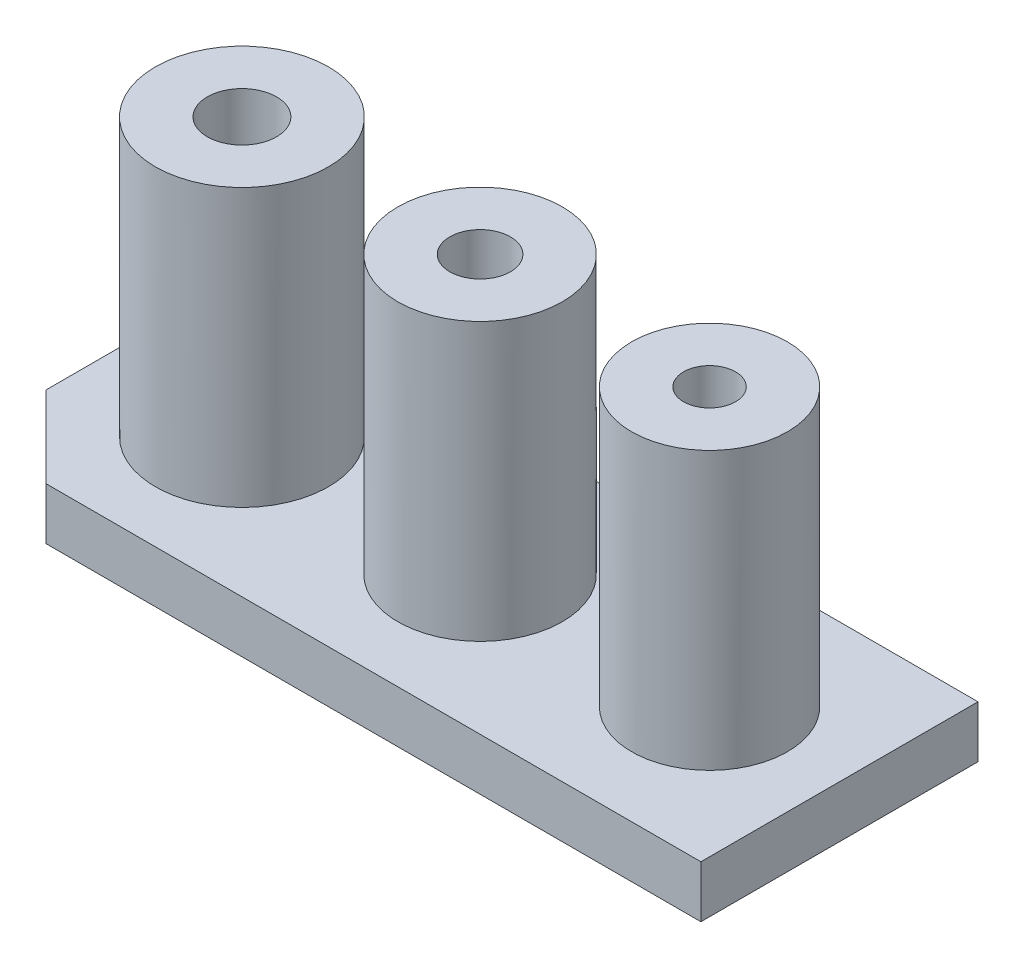
ISO-10303-21;
HEADER;
FILE_DESCRIPTION(('STEP AP214'),'2;1');
FILE_NAME('part.step','',(''),(''),'','','');
FILE_SCHEMA(('AUTOMOTIVE_DESIGN { 1 0 10303 214 1 1 1 1 }'));
ENDSEC;
DATA;
#1=APPLICATION_CONTEXT('core data for automotive mechanical design processes');
#2=APPLICATION_PROTOCOL_DEFINITION('international standard','automotive_design',2000,#1);
#3=PRODUCT_CONTEXT('',#1,'mechanical');
#4=PRODUCT('Part','Part','',(#3));
#5=PRODUCT_RELATED_PRODUCT_CATEGORY('part','',(#4));
#6=PRODUCT_DEFINITION_FORMATION('','',#4);
#7=PRODUCT_DEFINITION_CONTEXT('part definition',#1,'design');
#8=PRODUCT_DEFINITION('design','',#6,#7);
#9=PRODUCT_DEFINITION_SHAPE('','',#8);
#10=(LENGTH_UNIT() NAMED_UNIT(*) SI_UNIT(.MILLI.,.METRE.));
#11=(NAMED_UNIT(*) PLANE_ANGLE_UNIT() SI_UNIT($,.RADIAN.));
#12=(NAMED_UNIT(*) SI_UNIT($,.STERADIAN.) SOLID_ANGLE_UNIT());
#13=UNCERTAINTY_MEASURE_WITH_UNIT(LENGTH_MEASURE(1.E-05),#10,'distance_accuracy_value','');
#14=(GEOMETRIC_REPRESENTATION_CONTEXT(3) GLOBAL_UNCERTAINTY_ASSIGNED_CONTEXT((#13)) GLOBAL_UNIT_ASSIGNED_CONTEXT((#10,
#11,#12)) REPRESENTATION_CONTEXT('',''));
#15=CARTESIAN_POINT('',(0.,0.,0.));
#16=DIRECTION('',(0.,0.,1.));
#17=DIRECTION('',(1.,0.,0.));
#18=AXIS2_PLACEMENT_3D('',#15,#16,#17);
#19=CARTESIAN_POINT('',(0.,8.,0.));
#20=DIRECTION('',(0.,1.,0.));
#21=DIRECTION('',(0.,0.,1.));
#22=AXIS2_PLACEMENT_3D('',#19,#20,#21);
#23=PLANE('',#22);
#24=CARTESIAN_POINT('',(0.,8.,0.));
#25=DIRECTION('',(0.,1.,0.));
#26=DIRECTION('',(0.,0.,1.));
#27=AXIS2_PLACEMENT_3D('',#24,#25,#26);
#28=CIRCLE('',#27,2.5);
#29=CARTESIAN_POINT('',(0.,8.,2.5));
#30=VERTEX_POINT('',#29);
#31=EDGE_CURVE('E134',#30,#30,#28,.T.);
#32=ORIENTED_EDGE('',*,*,#31,.T.);
#33=EDGE_LOOP('',(#32));
#34=FACE_BOUND('',#33,.T.);
#35=CARTESIAN_POINT('',(0.,8.,0.));
#36=DIRECTION('',(0.,1.,0.));
#37=DIRECTION('',(0.,0.,1.));
#38=AXIS2_PLACEMENT_3D('',#35,#36,#37);
#39=CIRCLE('',#38,1.);
#40=CARTESIAN_POINT('',(0.,8.,1.));
#41=VERTEX_POINT('',#40);
#42=EDGE_CURVE('E131',#41,#41,#39,.T.);
#43=ORIENTED_EDGE('',*,*,#42,.F.);
#44=EDGE_LOOP('',(#43));
#45=FACE_BOUND('',#44,.T.);
#46=ADVANCED_FACE('F33',(#34,#45),#23,.T.);
#47=CARTESIAN_POINT('',(0.,8.,0.));
#48=DIRECTION('',(0.,-1.,0.));
#49=DIRECTION('',(0.,0.,-1.));
#50=AXIS2_PLACEMENT_3D('',#47,#48,#49);
#51=CYLINDRICAL_SURFACE('',#50,2.5);
#52=ORIENTED_EDGE('',*,*,#31,.F.);
#53=EDGE_LOOP('',(#52));
#54=FACE_BOUND('',#53,.T.);
#55=CARTESIAN_POINT('',(0.,0.,0.));
#56=DIRECTION('',(0.,-1.,0.));
#57=DIRECTION('',(0.,0.,-1.));
#58=AXIS2_PLACEMENT_3D('',#55,#56,#57);
#59=CIRCLE('',#58,2.5);
#60=CARTESIAN_POINT('',(0.,0.,-2.5));
#61=VERTEX_POINT('',#60);
#62=EDGE_CURVE('E127',#61,#61,#59,.T.);
#63=ORIENTED_EDGE('',*,*,#62,.F.);
#64=EDGE_LOOP('',(#63));
#65=FACE_BOUND('',#64,.T.);
#66=ADVANCED_FACE('F35',(#54,#65),#51,.T.);
#67=CARTESIAN_POINT('',(0.,8.,0.));
#68=DIRECTION('',(0.,-1.,0.));
#69=DIRECTION('',(0.,0.,-1.));
#70=AXIS2_PLACEMENT_3D('',#67,#68,#69);
#71=CYLINDRICAL_SURFACE('',#70,1.);
#72=ORIENTED_EDGE('',*,*,#42,.T.);
#73=EDGE_LOOP('',(#72));
#74=FACE_BOUND('',#73,.T.);
#75=CARTESIAN_POINT('',(0.,0.,0.));
#76=DIRECTION('',(0.,1.,0.));
#77=DIRECTION('',(0.,0.,1.));
#78=AXIS2_PLACEMENT_3D('',#75,#76,#77);
#79=CIRCLE('',#78,1.);
#80=CARTESIAN_POINT('',(0.,0.,1.));
#81=VERTEX_POINT('',#80);
#82=EDGE_CURVE('E130',#81,#81,#79,.T.);
#83=ORIENTED_EDGE('',*,*,#82,.F.);
#84=EDGE_LOOP('',(#83));
#85=FACE_BOUND('',#84,.T.);
#86=ADVANCED_FACE('F168',(#74,#85),#71,.F.);
#87=CARTESIAN_POINT('',(0.,0.,0.));
#88=DIRECTION('',(0.,-1.,0.));
#89=DIRECTION('',(0.,0.,-1.));
#90=AXIS2_PLACEMENT_3D('',#87,#88,#89);
#91=PLANE('',#90);
#92=ORIENTED_EDGE('',*,*,#82,.T.);
#93=EDGE_LOOP('',(#92));
#94=FACE_BOUND('',#93,.T.);
#95=ADVANCED_FACE('F150',(#94),#91,.F.);
#96=CARTESIAN_POINT('',(-2.82842712474619,-1.5,2.82842712474619));
#97=DIRECTION('',(-0.707106781186548,0.,0.707106781186546));
#98=DIRECTION('',(0.707106781186546,0.,0.707106781186549));
#99=AXIS2_PLACEMENT_3D('',#96,#97,#98);
#100=PLANE('',#99);
#101=DIRECTION('',(0.707106781186546,0.,0.707106781186549));
#102=VECTOR('',#101,1.);
#103=CARTESIAN_POINT('',(-2.82842712474619,0.,2.82842712474619));
#104=LINE('',#103,#102);
#105=CARTESIAN_POINT('',(-4.,0.,1.65685424949238));
#106=VERTEX_POINT('',#105);
#107=CARTESIAN_POINT('',(-1.65685424949238,0.,4.));
#108=VERTEX_POINT('',#107);
#109=EDGE_CURVE('E111',#106,#108,#104,.T.);
#110=ORIENTED_EDGE('',*,*,#109,.F.);
#111=DIRECTION('',(0.,1.,0.));
#112=VECTOR('',#111,1.);
#113=CARTESIAN_POINT('',(-4.,-1.5,1.65685424949238));
#114=LINE('',#113,#112);
#115=CARTESIAN_POINT('',(-4.,-1.5,1.65685424949238));
#116=VERTEX_POINT('',#115);
#117=EDGE_CURVE('E76',#116,#106,#114,.T.);
#118=ORIENTED_EDGE('',*,*,#117,.F.);
#119=DIRECTION('',(0.707106781186546,0.,0.707106781186549));
#120=VECTOR('',#119,1.);
#121=CARTESIAN_POINT('',(-2.82842712474619,-1.5,2.82842712474619));
#122=LINE('',#121,#120);
#123=CARTESIAN_POINT('',(-1.65685424949238,-1.5,4.));
#124=VERTEX_POINT('',#123);
#125=EDGE_CURVE('E122',#116,#124,#122,.T.);
#126=ORIENTED_EDGE('',*,*,#125,.T.);
#127=DIRECTION('',(0.,1.,0.));
#128=VECTOR('',#127,1.);
#129=CARTESIAN_POINT('',(-1.65685424949238,-1.5,4.));
#130=LINE('',#129,#128);
#131=EDGE_CURVE('E50',#124,#108,#130,.T.);
#132=ORIENTED_EDGE('',*,*,#131,.T.);
#133=EDGE_LOOP('',(#110,#118,#126,#132));
#134=FACE_BOUND('',#133,.T.);
#135=ADVANCED_FACE('F175',(#134),#100,.T.);
#136=CARTESIAN_POINT('',(-4.,-1.5,0.));
#137=DIRECTION('',(1.,0.,0.));
#138=DIRECTION('',(0.,0.,-1.));
#139=AXIS2_PLACEMENT_3D('',#136,#137,#138);
#140=PLANE('',#139);
#141=DIRECTION('',(0.,0.,-1.));
#142=VECTOR('',#141,1.);
#143=CARTESIAN_POINT('',(-4.,0.,0.));
#144=LINE('',#143,#142);
#145=CARTESIAN_POINT('',(-4.,0.,-4.));
#146=VERTEX_POINT('',#145);
#147=EDGE_CURVE('E113',#106,#146,#144,.T.);
#148=ORIENTED_EDGE('',*,*,#147,.T.);
#149=DIRECTION('',(0.,1.,0.));
#150=VECTOR('',#149,1.);
#151=CARTESIAN_POINT('',(-4.,-1.5,-4.));
#152=LINE('',#151,#150);
#153=CARTESIAN_POINT('',(-4.,-1.5,-4.));
#154=VERTEX_POINT('',#153);
#155=EDGE_CURVE('E103',#154,#146,#152,.T.);
#156=ORIENTED_EDGE('',*,*,#155,.F.);
#157=DIRECTION('',(0.,0.,-1.));
#158=VECTOR('',#157,1.);
#159=CARTESIAN_POINT('',(-4.,-1.5,0.));
#160=LINE('',#159,#158);
#161=EDGE_CURVE('E91',#116,#154,#160,.T.);
#162=ORIENTED_EDGE('',*,*,#161,.F.);
#163=ORIENTED_EDGE('',*,*,#117,.T.);
#164=EDGE_LOOP('',(#148,#156,#162,#163));
#165=FACE_BOUND('',#164,.T.);
#166=ADVANCED_FACE('F178',(#165),#140,.F.);
#167=CARTESIAN_POINT('',(0.,-1.5,-4.));
#168=DIRECTION('',(0.,0.,1.));
#169=DIRECTION('',(1.,0.,0.));
#170=AXIS2_PLACEMENT_3D('',#167,#168,#169);
#171=PLANE('',#170);
#172=DIRECTION('',(1.,0.,0.));
#173=VECTOR('',#172,1.);
#174=CARTESIAN_POINT('',(0.,0.,-4.));
#175=LINE('',#174,#173);
#176=CARTESIAN_POINT('',(17.25,0.,-4.00000000000001));
#177=VERTEX_POINT('',#176);
#178=EDGE_CURVE('E100',#146,#177,#175,.T.);
#179=ORIENTED_EDGE('',*,*,#178,.T.);
#180=DIRECTION('',(0.,1.,0.));
#181=VECTOR('',#180,1.);
#182=CARTESIAN_POINT('',(17.25,-1.5,-4.00000000000001));
#183=LINE('',#182,#181);
#184=CARTESIAN_POINT('',(17.25,-1.5,-4.00000000000001));
#185=VERTEX_POINT('',#184);
#186=EDGE_CURVE('E97',#185,#177,#183,.T.);
#187=ORIENTED_EDGE('',*,*,#186,.F.);
#188=DIRECTION('',(1.,0.,0.));
#189=VECTOR('',#188,1.);
#190=CARTESIAN_POINT('',(0.,-1.5,-4.));
#191=LINE('',#190,#189);
#192=EDGE_CURVE('E84',#154,#185,#191,.T.);
#193=ORIENTED_EDGE('',*,*,#192,.F.);
#194=ORIENTED_EDGE('',*,*,#155,.T.);
#195=EDGE_LOOP('',(#179,#187,#193,#194));
#196=FACE_BOUND('',#195,.T.);
#197=ADVANCED_FACE('F98',(#196),#171,.F.);
#198=CARTESIAN_POINT('',(17.25,-1.5,0.));
#199=DIRECTION('',(1.,0.,0.));
#200=DIRECTION('',(0.,0.,-1.));
#201=AXIS2_PLACEMENT_3D('',#198,#199,#200);
#202=PLANE('',#201);
#203=DIRECTION('',(0.,0.,-1.));
#204=VECTOR('',#203,1.);
#205=CARTESIAN_POINT('',(17.25,0.,0.));
#206=LINE('',#205,#204);
#207=CARTESIAN_POINT('',(17.25,0.,4.00000000000001));
#208=VERTEX_POINT('',#207);
#209=EDGE_CURVE('E117',#208,#177,#206,.T.);
#210=ORIENTED_EDGE('',*,*,#209,.F.);
#211=DIRECTION('',(0.,1.,0.));
#212=VECTOR('',#211,1.);
#213=CARTESIAN_POINT('',(17.25,-1.5,4.00000000000001));
#214=LINE('',#213,#212);
#215=CARTESIAN_POINT('',(17.25,-1.5,4.00000000000001));
#216=VERTEX_POINT('',#215);
#217=EDGE_CURVE('E67',#216,#208,#214,.T.);
#218=ORIENTED_EDGE('',*,*,#217,.F.);
#219=DIRECTION('',(0.,0.,-1.));
#220=VECTOR('',#219,1.);
#221=CARTESIAN_POINT('',(17.25,-1.5,0.));
#222=LINE('',#221,#220);
#223=EDGE_CURVE('E90',#216,#185,#222,.T.);
#224=ORIENTED_EDGE('',*,*,#223,.T.);
#225=ORIENTED_EDGE('',*,*,#186,.T.);
#226=EDGE_LOOP('',(#210,#218,#224,#225));
#227=FACE_BOUND('',#226,.T.);
#228=ADVANCED_FACE('F105',(#227),#202,.T.);
#229=CARTESIAN_POINT('',(0.,-1.5,4.));
#230=DIRECTION('',(0.,0.,1.));
#231=DIRECTION('',(1.,0.,0.));
#232=AXIS2_PLACEMENT_3D('',#229,#230,#231);
#233=PLANE('',#232);
#234=DIRECTION('',(1.,0.,0.));
#235=VECTOR('',#234,1.);
#236=CARTESIAN_POINT('',(0.,0.,4.));
#237=LINE('',#236,#235);
#238=EDGE_CURVE('E119',#108,#208,#237,.T.);
#239=ORIENTED_EDGE('',*,*,#238,.F.);
#240=ORIENTED_EDGE('',*,*,#131,.F.);
#241=DIRECTION('',(1.,0.,0.));
#242=VECTOR('',#241,1.);
#243=CARTESIAN_POINT('',(0.,-1.5,4.));
#244=LINE('',#243,#242);
#245=EDGE_CURVE('E106',#124,#216,#244,.T.);
#246=ORIENTED_EDGE('',*,*,#245,.T.);
#247=ORIENTED_EDGE('',*,*,#217,.T.);
#248=EDGE_LOOP('',(#239,#240,#246,#247));
#249=FACE_BOUND('',#248,.T.);
#250=ADVANCED_FACE('F154',(#249),#233,.T.);
#251=CARTESIAN_POINT('',(0.,-1.5,0.));
#252=DIRECTION('',(0.,-1.,0.));
#253=DIRECTION('',(0.,0.,-1.));
#254=AXIS2_PLACEMENT_3D('',#251,#252,#253);
#255=PLANE('',#254);
#256=ORIENTED_EDGE('',*,*,#125,.F.);
#257=ORIENTED_EDGE('',*,*,#161,.T.);
#258=ORIENTED_EDGE('',*,*,#192,.T.);
#259=ORIENTED_EDGE('',*,*,#223,.F.);
#260=ORIENTED_EDGE('',*,*,#245,.F.);
#261=EDGE_LOOP('',(#256,#257,#258,#259,#260));
#262=FACE_BOUND('',#261,.T.);
#263=ADVANCED_FACE('F87',(#262),#255,.T.);
#264=CARTESIAN_POINT('',(13.5,0.,0.));
#265=DIRECTION('',(0.,-1.,0.));
#266=DIRECTION('',(0.,0.,-1.));
#267=AXIS2_PLACEMENT_3D('',#264,#265,#266);
#268=CIRCLE('',#267,2.25);
#269=CARTESIAN_POINT('',(13.5,0.,-2.25));
#270=VERTEX_POINT('',#269);
#271=EDGE_CURVE('E11',#270,#270,#268,.F.);
#272=ORIENTED_EDGE('',*,*,#271,.F.);
#273=EDGE_LOOP('',(#272));
#274=FACE_BOUND('',#273,.T.);
#275=CARTESIAN_POINT('',(6.875,0.,0.));
#276=DIRECTION('',(0.,-1.,0.));
#277=DIRECTION('',(0.,0.,-1.));
#278=AXIS2_PLACEMENT_3D('',#275,#276,#277);
#279=CIRCLE('',#278,2.375);
#280=CARTESIAN_POINT('',(6.875,0.,-2.375));
#281=VERTEX_POINT('',#280);
#282=EDGE_CURVE('E42',#281,#281,#279,.F.);
#283=ORIENTED_EDGE('',*,*,#282,.F.);
#284=EDGE_LOOP('',(#283));
#285=FACE_BOUND('',#284,.T.);
#286=ORIENTED_EDGE('',*,*,#62,.T.);
#287=EDGE_LOOP('',(#286));
#288=FACE_BOUND('',#287,.T.);
#289=ORIENTED_EDGE('',*,*,#109,.T.);
#290=ORIENTED_EDGE('',*,*,#238,.T.);
#291=ORIENTED_EDGE('',*,*,#209,.T.);
#292=ORIENTED_EDGE('',*,*,#178,.F.);
#293=ORIENTED_EDGE('',*,*,#147,.F.);
#294=EDGE_LOOP('',(#289,#290,#291,#292,#293));
#295=FACE_BOUND('',#294,.T.);
#296=ADVANCED_FACE('F143',(#274,#285,#288,#295),#91,.F.);
#297=CARTESIAN_POINT('',(6.875,8.,0.));
#298=DIRECTION('',(0.,1.,0.));
#299=DIRECTION('',(0.,0.,1.));
#300=AXIS2_PLACEMENT_3D('',#297,#298,#299);
#301=PLANE('',#300);
#302=CARTESIAN_POINT('',(6.875,8.,0.));
#303=DIRECTION('',(0.,1.,0.));
#304=DIRECTION('',(0.,0.,1.));
#305=AXIS2_PLACEMENT_3D('',#302,#303,#304);
#306=CIRCLE('',#305,2.375);
#307=CARTESIAN_POINT('',(6.875,8.,2.375));
#308=VERTEX_POINT('',#307);
#309=EDGE_CURVE('E114',#308,#308,#306,.T.);
#310=ORIENTED_EDGE('',*,*,#309,.T.);
#311=EDGE_LOOP('',(#310));
#312=FACE_BOUND('',#311,.T.);
#313=CARTESIAN_POINT('',(6.875,8.,0.));
#314=DIRECTION('',(0.,1.,0.));
#315=DIRECTION('',(0.,0.,1.));
#316=AXIS2_PLACEMENT_3D('',#313,#314,#315);
#317=CIRCLE('',#316,0.875);
#318=CARTESIAN_POINT('',(6.875,8.,0.875));
#319=VERTEX_POINT('',#318);
#320=EDGE_CURVE('E301',#319,#319,#317,.T.);
#321=ORIENTED_EDGE('',*,*,#320,.F.);
#322=EDGE_LOOP('',(#321));
#323=FACE_BOUND('',#322,.T.);
#324=ADVANCED_FACE('F146',(#312,#323),#301,.T.);
#325=CARTESIAN_POINT('',(6.875,8.,0.));
#326=DIRECTION('',(0.,-1.,0.));
#327=DIRECTION('',(0.,0.,-1.));
#328=AXIS2_PLACEMENT_3D('',#325,#326,#327);
#329=CYLINDRICAL_SURFACE('',#328,2.375);
#330=ORIENTED_EDGE('',*,*,#309,.F.);
#331=EDGE_LOOP('',(#330));
#332=FACE_BOUND('',#331,.T.);
#333=ORIENTED_EDGE('',*,*,#282,.T.);
#334=EDGE_LOOP('',(#333));
#335=FACE_BOUND('',#334,.T.);
#336=ADVANCED_FACE('F141',(#332,#335),#329,.T.);
#337=CARTESIAN_POINT('',(6.875,8.,0.));
#338=DIRECTION('',(0.,-1.,0.));
#339=DIRECTION('',(0.,0.,-1.));
#340=AXIS2_PLACEMENT_3D('',#337,#338,#339);
#341=CYLINDRICAL_SURFACE('',#340,0.875);
#342=ORIENTED_EDGE('',*,*,#320,.T.);
#343=EDGE_LOOP('',(#342));
#344=FACE_BOUND('',#343,.T.);
#345=CARTESIAN_POINT('',(6.875,0.,0.));
#346=DIRECTION('',(0.,1.,0.));
#347=DIRECTION('',(0.,0.,1.));
#348=AXIS2_PLACEMENT_3D('',#345,#346,#347);
#349=CIRCLE('',#348,0.875);
#350=CARTESIAN_POINT('',(6.875,0.,0.875));
#351=VERTEX_POINT('',#350);
#352=EDGE_CURVE('E300',#351,#351,#349,.T.);
#353=ORIENTED_EDGE('',*,*,#352,.F.);
#354=EDGE_LOOP('',(#353));
#355=FACE_BOUND('',#354,.T.);
#356=ADVANCED_FACE('F227',(#344,#355),#341,.F.);
#357=ORIENTED_EDGE('',*,*,#352,.T.);
#358=EDGE_LOOP('',(#357));
#359=FACE_BOUND('',#358,.T.);
#360=ADVANCED_FACE('F237',(#359),#91,.F.);
#361=CARTESIAN_POINT('',(13.5,8.,0.));
#362=DIRECTION('',(0.,1.,0.));
#363=DIRECTION('',(0.,0.,1.));
#364=AXIS2_PLACEMENT_3D('',#361,#362,#363);
#365=PLANE('',#364);
#366=CARTESIAN_POINT('',(13.5,8.,0.));
#367=DIRECTION('',(0.,1.,0.));
#368=DIRECTION('',(0.,0.,1.));
#369=AXIS2_PLACEMENT_3D('',#366,#367,#368);
#370=CIRCLE('',#369,2.25);
#371=CARTESIAN_POINT('',(13.5,8.,2.25));
#372=VERTEX_POINT('',#371);
#373=EDGE_CURVE('E295',#372,#372,#370,.T.);
#374=ORIENTED_EDGE('',*,*,#373,.T.);
#375=EDGE_LOOP('',(#374));
#376=FACE_BOUND('',#375,.T.);
#377=CARTESIAN_POINT('',(13.5,8.,0.));
#378=DIRECTION('',(0.,1.,0.));
#379=DIRECTION('',(0.,0.,1.));
#380=AXIS2_PLACEMENT_3D('',#377,#378,#379);
#381=CIRCLE('',#380,0.750000000000002);
#382=CARTESIAN_POINT('',(13.5,8.,0.750000000000002));
#383=VERTEX_POINT('',#382);
#384=EDGE_CURVE('E292',#383,#383,#381,.T.);
#385=ORIENTED_EDGE('',*,*,#384,.F.);
#386=EDGE_LOOP('',(#385));
#387=FACE_BOUND('',#386,.T.);
#388=ADVANCED_FACE('F247',(#376,#387),#365,.T.);
#389=CARTESIAN_POINT('',(13.5,8.,0.));
#390=DIRECTION('',(0.,-1.,0.));
#391=DIRECTION('',(0.,0.,-1.));
#392=AXIS2_PLACEMENT_3D('',#389,#390,#391);
#393=CYLINDRICAL_SURFACE('',#392,2.25);
#394=ORIENTED_EDGE('',*,*,#373,.F.);
#395=EDGE_LOOP('',(#394));
#396=FACE_BOUND('',#395,.T.);
#397=ORIENTED_EDGE('',*,*,#271,.T.);
#398=EDGE_LOOP('',(#397));
#399=FACE_BOUND('',#398,.T.);
#400=ADVANCED_FACE('F256',(#396,#399),#393,.T.);
#401=CARTESIAN_POINT('',(13.5,8.,0.));
#402=DIRECTION('',(0.,-1.,0.));
#403=DIRECTION('',(0.,0.,-1.));
#404=AXIS2_PLACEMENT_3D('',#401,#402,#403);
#405=CYLINDRICAL_SURFACE('',#404,0.750000000000002);
#406=ORIENTED_EDGE('',*,*,#384,.T.);
#407=EDGE_LOOP('',(#406));
#408=FACE_BOUND('',#407,.T.);
#409=CARTESIAN_POINT('',(13.5,0.,0.));
#410=DIRECTION('',(0.,1.,0.));
#411=DIRECTION('',(0.,0.,1.));
#412=AXIS2_PLACEMENT_3D('',#409,#410,#411);
#413=CIRCLE('',#412,0.750000000000002);
#414=CARTESIAN_POINT('',(13.5,0.,0.750000000000002));
#415=VERTEX_POINT('',#414);
#416=EDGE_CURVE('E290',#415,#415,#413,.T.);
#417=ORIENTED_EDGE('',*,*,#416,.F.);
#418=EDGE_LOOP('',(#417));
#419=FACE_BOUND('',#418,.T.);
#420=ADVANCED_FACE('F266',(#408,#419),#405,.F.);
#421=ORIENTED_EDGE('',*,*,#416,.T.);
#422=EDGE_LOOP('',(#421));
#423=FACE_BOUND('',#422,.T.);
#424=ADVANCED_FACE('F149',(#423),#91,.F.);
#425=CLOSED_SHELL('',(#46,#66,#86,#95,#135,#166,#197,#228,#250,#263,#296,#324,#336,#356,#360,
#388,#400,#420,#424));
#426=MANIFOLD_SOLID_BREP('B2',#425);
#427=ADVANCED_BREP_SHAPE_REPRESENTATION('',(#18,#426),#14);
#428=SHAPE_DEFINITION_REPRESENTATION(#9,#427);
ENDSEC;
END-ISO-10303-21;
